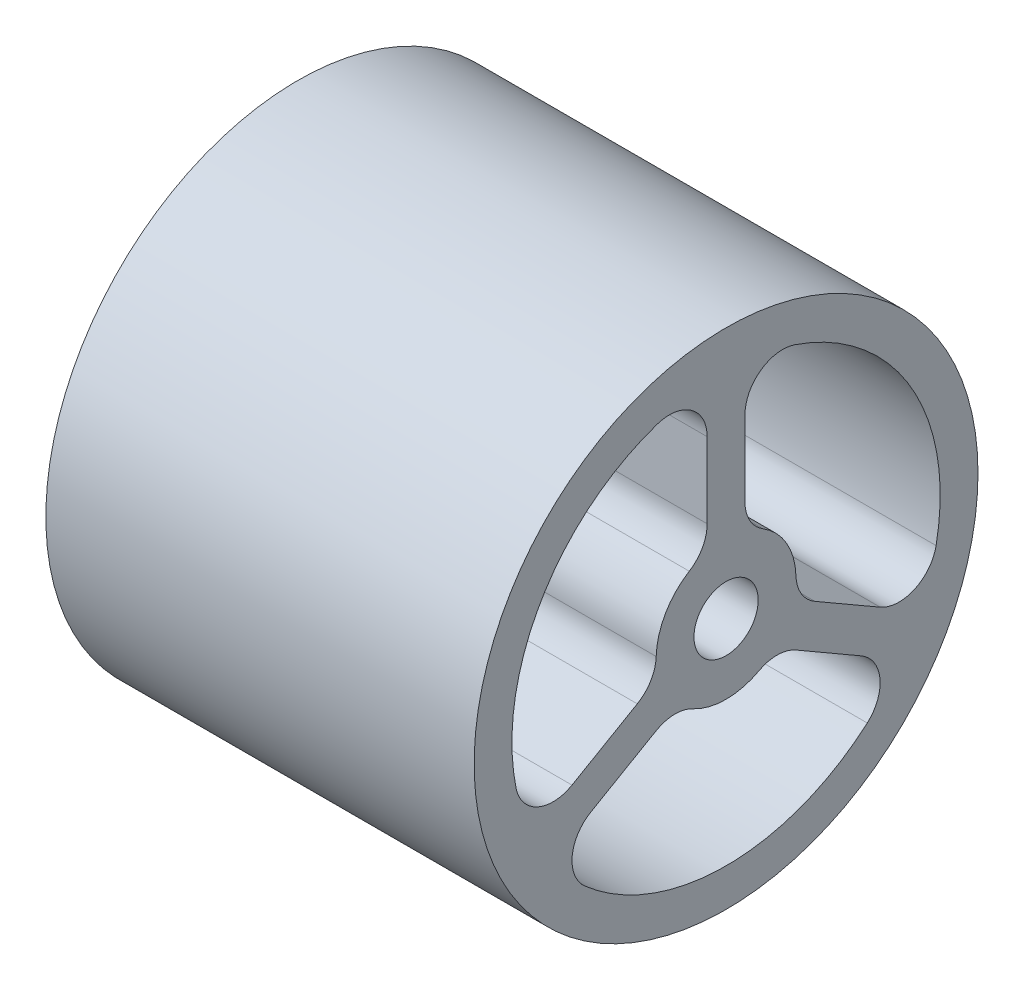
ISO-10303-21;
HEADER;
FILE_DESCRIPTION(('STEP AP214'),'2;1');
FILE_NAME('part.step','',(''),(''),'','','');
FILE_SCHEMA(('AUTOMOTIVE_DESIGN { 1 0 10303 214 1 1 1 1 }'));
ENDSEC;
DATA;
#1=APPLICATION_CONTEXT('core data for automotive mechanical design processes');
#2=APPLICATION_PROTOCOL_DEFINITION('international standard','automotive_design',2000,#1);
#3=PRODUCT_CONTEXT('',#1,'mechanical');
#4=PRODUCT('Part','Part','',(#3));
#5=PRODUCT_RELATED_PRODUCT_CATEGORY('part','',(#4));
#6=PRODUCT_DEFINITION_FORMATION('','',#4);
#7=PRODUCT_DEFINITION_CONTEXT('part definition',#1,'design');
#8=PRODUCT_DEFINITION('design','',#6,#7);
#9=PRODUCT_DEFINITION_SHAPE('','',#8);
#10=(LENGTH_UNIT() NAMED_UNIT(*) SI_UNIT(.MILLI.,.METRE.));
#11=(NAMED_UNIT(*) PLANE_ANGLE_UNIT() SI_UNIT($,.RADIAN.));
#12=(NAMED_UNIT(*) SI_UNIT($,.STERADIAN.) SOLID_ANGLE_UNIT());
#13=UNCERTAINTY_MEASURE_WITH_UNIT(LENGTH_MEASURE(1.E-05),#10,'distance_accuracy_value','');
#14=(GEOMETRIC_REPRESENTATION_CONTEXT(3) GLOBAL_UNCERTAINTY_ASSIGNED_CONTEXT((#13)) GLOBAL_UNIT_ASSIGNED_CONTEXT((#10,
#11,#12)) REPRESENTATION_CONTEXT('',''));
#15=CARTESIAN_POINT('',(0.,0.,0.));
#16=DIRECTION('',(0.,0.,1.));
#17=DIRECTION('',(1.,0.,0.));
#18=AXIS2_PLACEMENT_3D('',#15,#16,#17);
#19=CARTESIAN_POINT('',(34.,0.,0.));
#20=DIRECTION('',(-1.,0.,0.));
#21=DIRECTION('',(0.,0.,1.));
#22=AXIS2_PLACEMENT_3D('',#19,#20,#21);
#23=CYLINDRICAL_SURFACE('',#22,17.);
#24=CARTESIAN_POINT('',(34.,0.,0.));
#25=DIRECTION('',(1.,0.,0.));
#26=DIRECTION('',(0.,0.,-1.));
#27=AXIS2_PLACEMENT_3D('',#24,#25,#26);
#28=CIRCLE('',#27,17.);
#29=CARTESIAN_POINT('',(34.,-3.31672729076962,-16.6733116110347));
#30=VERTEX_POINT('',#29);
#31=CARTESIAN_POINT('',(34.,16.0978750657549,-5.46428571428572));
#32=VERTEX_POINT('',#31);
#33=EDGE_CURVE('E362',#30,#32,#28,.T.);
#34=ORIENTED_EDGE('',*,*,#33,.T.);
#35=DIRECTION('',(-1.,0.,0.));
#36=VECTOR('',#35,1.);
#37=CARTESIAN_POINT('',(34.,16.0978750657549,-5.46428571428572));
#38=LINE('',#37,#36);
#39=CARTESIAN_POINT('',(0.,16.0978750657549,-5.46428571428572));
#40=VERTEX_POINT('',#39);
#41=EDGE_CURVE('E215',#32,#40,#38,.T.);
#42=ORIENTED_EDGE('',*,*,#41,.T.);
#43=CARTESIAN_POINT('',(0.,0.,0.));
#44=DIRECTION('',(1.,0.,0.));
#45=DIRECTION('',(0.,0.,-1.));
#46=AXIS2_PLACEMENT_3D('',#43,#44,#45);
#47=CIRCLE('',#46,17.);
#48=CARTESIAN_POINT('',(0.,-3.31672729076962,-16.6733116110347));
#49=VERTEX_POINT('',#48);
#50=EDGE_CURVE('E199',#49,#40,#47,.T.);
#51=ORIENTED_EDGE('',*,*,#50,.F.);
#52=DIRECTION('',(-1.,0.,0.));
#53=VECTOR('',#52,1.);
#54=CARTESIAN_POINT('',(34.,-3.31672729076962,-16.6733116110347));
#55=LINE('',#54,#53);
#56=EDGE_CURVE('E212',#49,#30,#55,.F.);
#57=ORIENTED_EDGE('',*,*,#56,.T.);
#58=EDGE_LOOP('',(#34,#42,#51,#57));
#59=FACE_BOUND('',#58,.T.);
#60=ADVANCED_FACE('F33',(#59),#23,.F.);
#61=CARTESIAN_POINT('',(34.,1.29903810567666,-0.750000000000001));
#62=DIRECTION('',(0.,0.866025403784439,-0.5));
#63=DIRECTION('',(0.,0.5,0.866025403784439));
#64=AXIS2_PLACEMENT_3D('',#61,#62,#63);
#65=PLANE('',#64);
#66=DIRECTION('',(0.,-0.5,-0.866025403784439));
#67=VECTOR('',#66,1.);
#68=CARTESIAN_POINT('',(0.,1.29903810567666,-0.750000000000001));
#69=LINE('',#68,#67);
#70=CARTESIAN_POINT('',(0.,-2.33594813913913,-7.04598086083495));
#71=VERTEX_POINT('',#70);
#72=CARTESIAN_POINT('',(0.,-5.32949868610477,-12.230962503205));
#73=VERTEX_POINT('',#72);
#74=EDGE_CURVE('E201',#71,#73,#69,.T.);
#75=ORIENTED_EDGE('',*,*,#74,.F.);
#76=DIRECTION('',(-1.,0.,0.));
#77=VECTOR('',#76,1.);
#78=CARTESIAN_POINT('',(34.,-2.33594813913913,-7.04598086083495));
#79=LINE('',#78,#77);
#80=CARTESIAN_POINT('',(34.,-2.33594813913913,-7.04598086083495));
#81=VERTEX_POINT('',#80);
#82=EDGE_CURVE('E244',#71,#81,#79,.F.);
#83=ORIENTED_EDGE('',*,*,#82,.T.);
#84=DIRECTION('',(0.,-0.5,-0.866025403784439));
#85=VECTOR('',#84,1.);
#86=CARTESIAN_POINT('',(34.,1.29903810567666,-0.750000000000001));
#87=LINE('',#86,#85);
#88=CARTESIAN_POINT('',(34.,-5.32949868610477,-12.230962503205));
#89=VERTEX_POINT('',#88);
#90=EDGE_CURVE('E366',#81,#89,#87,.T.);
#91=ORIENTED_EDGE('',*,*,#90,.T.);
#92=DIRECTION('',(1.,0.,0.));
#93=VECTOR('',#92,1.);
#94=CARTESIAN_POINT('',(0.,-5.32949868610477,-12.230962503205));
#95=LINE('',#94,#93);
#96=EDGE_CURVE('E242',#89,#73,#95,.F.);
#97=ORIENTED_EDGE('',*,*,#96,.T.);
#98=EDGE_LOOP('',(#75,#83,#91,#97));
#99=FACE_BOUND('',#98,.T.);
#100=ADVANCED_FACE('F466',(#99),#65,.T.);
#101=CARTESIAN_POINT('',(34.,0.,0.));
#102=DIRECTION('',(-1.,0.,0.));
#103=DIRECTION('',(0.,0.,1.));
#104=AXIS2_PLACEMENT_3D('',#101,#102,#103);
#105=CYLINDRICAL_SURFACE('',#104,5.55);
#106=CARTESIAN_POINT('',(0.,0.,0.));
#107=DIRECTION('',(1.,0.,0.));
#108=DIRECTION('',(0.,0.,-1.));
#109=AXIS2_PLACEMENT_3D('',#106,#107,#108);
#110=CIRCLE('',#109,5.55);
#111=CARTESIAN_POINT('',(0.,0.17015331003377,-5.54739108510339));
#112=VERTEX_POINT('',#111);
#113=CARTESIAN_POINT('',(0.,4.71910494940997,-2.92105263157895));
#114=VERTEX_POINT('',#113);
#115=EDGE_CURVE('E387',#112,#114,#110,.T.);
#116=ORIENTED_EDGE('',*,*,#115,.T.);
#117=DIRECTION('',(-1.,0.,0.));
#118=VECTOR('',#117,1.);
#119=CARTESIAN_POINT('',(34.,4.71910494940997,-2.92105263157895));
#120=LINE('',#119,#118);
#121=CARTESIAN_POINT('',(34.,4.71910494940997,-2.92105263157895));
#122=VERTEX_POINT('',#121);
#123=EDGE_CURVE('E240',#114,#122,#120,.F.);
#124=ORIENTED_EDGE('',*,*,#123,.T.);
#125=CARTESIAN_POINT('',(34.,0.,0.));
#126=DIRECTION('',(1.,0.,0.));
#127=DIRECTION('',(0.,0.,-1.));
#128=AXIS2_PLACEMENT_3D('',#125,#126,#127);
#129=CIRCLE('',#128,5.55);
#130=CARTESIAN_POINT('',(34.,0.17015331003377,-5.54739108510339));
#131=VERTEX_POINT('',#130);
#132=EDGE_CURVE('E355',#131,#122,#129,.T.);
#133=ORIENTED_EDGE('',*,*,#132,.F.);
#134=DIRECTION('',(-1.,0.,0.));
#135=VECTOR('',#134,1.);
#136=CARTESIAN_POINT('',(34.,0.17015331003377,-5.54739108510339));
#137=LINE('',#136,#135);
#138=EDGE_CURVE('E237',#131,#112,#137,.T.);
#139=ORIENTED_EDGE('',*,*,#138,.T.);
#140=EDGE_LOOP('',(#116,#124,#133,#139));
#141=FACE_BOUND('',#140,.T.);
#142=ADVANCED_FACE('F448',(#141),#105,.T.);
#143=CARTESIAN_POINT('',(34.,-1.29903810567666,0.75));
#144=DIRECTION('',(0.,0.866025403784439,-0.5));
#145=DIRECTION('',(0.,0.5,0.866025403784439));
#146=AXIS2_PLACEMENT_3D('',#143,#144,#145);
#147=PLANE('',#146);
#148=DIRECTION('',(0.,-0.5,-0.866025403784439));
#149=VECTOR('',#148,1.);
#150=CARTESIAN_POINT('',(34.,-1.29903810567666,0.75));
#151=LINE('',#150,#149);
#152=CARTESIAN_POINT('',(34.,-4.93402435049245,-5.54598086083495));
#153=VERTEX_POINT('',#152);
#154=CARTESIAN_POINT('',(34.,-7.92757489745809,-10.730962503205));
#155=VERTEX_POINT('',#154);
#156=EDGE_CURVE('E352',#153,#155,#151,.T.);
#157=ORIENTED_EDGE('',*,*,#156,.F.);
#158=DIRECTION('',(1.,0.,0.));
#159=VECTOR('',#158,1.);
#160=CARTESIAN_POINT('',(0.,-4.93402435049245,-5.54598086083495));
#161=LINE('',#160,#159);
#162=CARTESIAN_POINT('',(0.,-4.93402435049245,-5.54598086083495));
#163=VERTEX_POINT('',#162);
#164=EDGE_CURVE('E248',#153,#163,#161,.F.);
#165=ORIENTED_EDGE('',*,*,#164,.T.);
#166=DIRECTION('',(0.,-0.5,-0.866025403784439));
#167=VECTOR('',#166,1.);
#168=CARTESIAN_POINT('',(0.,-1.29903810567666,0.75));
#169=LINE('',#168,#167);
#170=CARTESIAN_POINT('',(0.,-7.92757489745809,-10.730962503205));
#171=VERTEX_POINT('',#170);
#172=EDGE_CURVE('E386',#163,#171,#169,.T.);
#173=ORIENTED_EDGE('',*,*,#172,.T.);
#174=DIRECTION('',(-1.,0.,0.));
#175=VECTOR('',#174,1.);
#176=CARTESIAN_POINT('',(34.,-7.92757489745809,-10.730962503205));
#177=LINE('',#176,#175);
#178=EDGE_CURVE('E246',#171,#155,#177,.F.);
#179=ORIENTED_EDGE('',*,*,#178,.T.);
#180=EDGE_LOOP('',(#157,#165,#173,#179));
#181=FACE_BOUND('',#180,.T.);
#182=ADVANCED_FACE('F432',(#181),#147,.F.);
#183=CARTESIAN_POINT('',(0.,-12.7811477749853,11.209025896749));
#184=VERTEX_POINT('',#183);
#185=CARTESIAN_POINT('',(0.,-12.7811477749853,-11.209025896749));
#186=VERTEX_POINT('',#185);
#187=EDGE_CURVE('E219',#184,#186,#47,.T.);
#188=ORIENTED_EDGE('',*,*,#187,.F.);
#189=DIRECTION('',(-1.,0.,0.));
#190=VECTOR('',#189,1.);
#191=CARTESIAN_POINT('',(34.,-12.7811477749853,11.209025896749));
#192=LINE('',#191,#190);
#193=CARTESIAN_POINT('',(34.,-12.7811477749853,11.209025896749));
#194=VERTEX_POINT('',#193);
#195=EDGE_CURVE('E264',#184,#194,#192,.F.);
#196=ORIENTED_EDGE('',*,*,#195,.T.);
#197=CARTESIAN_POINT('',(34.,-12.7811477749853,-11.209025896749));
#198=VERTEX_POINT('',#197);
#199=EDGE_CURVE('E357',#194,#198,#28,.T.);
#200=ORIENTED_EDGE('',*,*,#199,.T.);
#201=DIRECTION('',(-1.,0.,0.));
#202=VECTOR('',#201,1.);
#203=CARTESIAN_POINT('',(34.,-12.7811477749853,-11.209025896749));
#204=LINE('',#203,#202);
#205=EDGE_CURVE('E261',#198,#186,#204,.T.);
#206=ORIENTED_EDGE('',*,*,#205,.T.);
#207=EDGE_LOOP('',(#188,#196,#200,#206));
#208=FACE_BOUND('',#207,.T.);
#209=ADVANCED_FACE('F425',(#208),#23,.F.);
#210=CARTESIAN_POINT('',(34.,-1.29903810567666,-0.749999999999999));
#211=DIRECTION('',(0.,-0.866025403784439,-0.5));
#212=DIRECTION('',(0.,0.5,-0.866025403784439));
#213=AXIS2_PLACEMENT_3D('',#210,#211,#212);
#214=PLANE('',#213);
#215=DIRECTION('',(0.,-0.5,0.866025403784439));
#216=VECTOR('',#215,1.);
#217=CARTESIAN_POINT('',(0.,-1.29903810567666,-0.749999999999999));
#218=LINE('',#217,#216);
#219=CARTESIAN_POINT('',(0.,-4.93402435049245,5.54598086083495));
#220=VERTEX_POINT('',#219);
#221=CARTESIAN_POINT('',(0.,-7.92757489745808,10.730962503205));
#222=VERTEX_POINT('',#221);
#223=EDGE_CURVE('E390',#220,#222,#218,.T.);
#224=ORIENTED_EDGE('',*,*,#223,.F.);
#225=DIRECTION('',(-1.,0.,0.));
#226=VECTOR('',#225,1.);
#227=CARTESIAN_POINT('',(34.,-4.93402435049245,5.54598086083495));
#228=LINE('',#227,#226);
#229=CARTESIAN_POINT('',(34.,-4.93402435049245,5.54598086083495));
#230=VERTEX_POINT('',#229);
#231=EDGE_CURVE('E259',#220,#230,#228,.F.);
#232=ORIENTED_EDGE('',*,*,#231,.T.);
#233=DIRECTION('',(0.,-0.5,0.866025403784439));
#234=VECTOR('',#233,1.);
#235=CARTESIAN_POINT('',(34.,-1.29903810567666,-0.749999999999999));
#236=LINE('',#235,#234);
#237=CARTESIAN_POINT('',(34.,-7.92757489745808,10.730962503205));
#238=VERTEX_POINT('',#237);
#239=EDGE_CURVE('E363',#230,#238,#236,.T.);
#240=ORIENTED_EDGE('',*,*,#239,.T.);
#241=DIRECTION('',(1.,0.,0.));
#242=VECTOR('',#241,1.);
#243=CARTESIAN_POINT('',(0.,-7.92757489745808,10.730962503205));
#244=LINE('',#243,#242);
#245=EDGE_CURVE('E256',#238,#222,#244,.F.);
#246=ORIENTED_EDGE('',*,*,#245,.T.);
#247=EDGE_LOOP('',(#224,#232,#240,#246));
#248=FACE_BOUND('',#247,.T.);
#249=ADVANCED_FACE('F415',(#248),#214,.T.);
#250=CARTESIAN_POINT('',(0.,-4.88925825944374,2.62633845352444));
#251=VERTEX_POINT('',#250);
#252=CARTESIAN_POINT('',(0.,-4.88925825944374,-2.62633845352444));
#253=VERTEX_POINT('',#252);
#254=EDGE_CURVE('E216',#251,#253,#110,.T.);
#255=ORIENTED_EDGE('',*,*,#254,.T.);
#256=DIRECTION('',(-1.,0.,0.));
#257=VECTOR('',#256,1.);
#258=CARTESIAN_POINT('',(34.,-4.88925825944374,-2.62633845352444));
#259=LINE('',#258,#257);
#260=CARTESIAN_POINT('',(34.,-4.88925825944374,-2.62633845352444));
#261=VERTEX_POINT('',#260);
#262=EDGE_CURVE('E254',#253,#261,#259,.F.);
#263=ORIENTED_EDGE('',*,*,#262,.T.);
#264=CARTESIAN_POINT('',(34.,-4.88925825944374,2.62633845352444));
#265=VERTEX_POINT('',#264);
#266=EDGE_CURVE('E354',#265,#261,#129,.T.);
#267=ORIENTED_EDGE('',*,*,#266,.F.);
#268=DIRECTION('',(-1.,0.,0.));
#269=VECTOR('',#268,1.);
#270=CARTESIAN_POINT('',(34.,-4.88925825944374,2.62633845352444));
#271=LINE('',#270,#269);
#272=EDGE_CURVE('E251',#265,#251,#271,.T.);
#273=ORIENTED_EDGE('',*,*,#272,.T.);
#274=EDGE_LOOP('',(#255,#263,#267,#273));
#275=FACE_BOUND('',#274,.T.);
#276=ADVANCED_FACE('F441',(#275),#105,.T.);
#277=CARTESIAN_POINT('',(34.,1.29903810567666,0.749999999999999));
#278=DIRECTION('',(0.,-0.866025403784439,-0.5));
#279=DIRECTION('',(0.,0.5,-0.866025403784439));
#280=AXIS2_PLACEMENT_3D('',#277,#278,#279);
#281=PLANE('',#280);
#282=DIRECTION('',(0.,-0.5,0.866025403784439));
#283=VECTOR('',#282,1.);
#284=CARTESIAN_POINT('',(34.,1.29903810567666,0.749999999999999));
#285=LINE('',#284,#283);
#286=CARTESIAN_POINT('',(34.,-2.33594813913913,7.04598086083495));
#287=VERTEX_POINT('',#286);
#288=CARTESIAN_POINT('',(34.,-5.32949868610477,12.230962503205));
#289=VERTEX_POINT('',#288);
#290=EDGE_CURVE('E400',#287,#289,#285,.T.);
#291=ORIENTED_EDGE('',*,*,#290,.F.);
#292=DIRECTION('',(1.,0.,0.));
#293=VECTOR('',#292,1.);
#294=CARTESIAN_POINT('',(0.,-2.33594813913913,7.04598086083495));
#295=LINE('',#294,#293);
#296=CARTESIAN_POINT('',(0.,-2.33594813913913,7.04598086083495));
#297=VERTEX_POINT('',#296);
#298=EDGE_CURVE('E268',#287,#297,#295,.F.);
#299=ORIENTED_EDGE('',*,*,#298,.T.);
#300=DIRECTION('',(0.,-0.5,0.866025403784439));
#301=VECTOR('',#300,1.);
#302=CARTESIAN_POINT('',(0.,1.29903810567666,0.749999999999999));
#303=LINE('',#302,#301);
#304=CARTESIAN_POINT('',(0.,-5.32949868610477,12.230962503205));
#305=VERTEX_POINT('',#304);
#306=EDGE_CURVE('E381',#297,#305,#303,.T.);
#307=ORIENTED_EDGE('',*,*,#306,.T.);
#308=DIRECTION('',(-1.,0.,0.));
#309=VECTOR('',#308,1.);
#310=CARTESIAN_POINT('',(34.,-5.32949868610477,12.230962503205));
#311=LINE('',#310,#309);
#312=EDGE_CURVE('E266',#305,#289,#311,.F.);
#313=ORIENTED_EDGE('',*,*,#312,.T.);
#314=EDGE_LOOP('',(#291,#299,#307,#313));
#315=FACE_BOUND('',#314,.T.);
#316=ADVANCED_FACE('F484',(#315),#281,.F.);
#317=CARTESIAN_POINT('',(0.,16.0978750657549,5.46428571428572));
#318=VERTEX_POINT('',#317);
#319=CARTESIAN_POINT('',(0.,-3.31672729076962,16.6733116110347));
#320=VERTEX_POINT('',#319);
#321=EDGE_CURVE('E218',#318,#320,#47,.T.);
#322=ORIENTED_EDGE('',*,*,#321,.F.);
#323=DIRECTION('',(-1.,0.,0.));
#324=VECTOR('',#323,1.);
#325=CARTESIAN_POINT('',(34.,16.0978750657549,5.46428571428572));
#326=LINE('',#325,#324);
#327=CARTESIAN_POINT('',(34.,16.0978750657549,5.46428571428572));
#328=VERTEX_POINT('',#327);
#329=EDGE_CURVE('E55',#318,#328,#326,.F.);
#330=ORIENTED_EDGE('',*,*,#329,.T.);
#331=CARTESIAN_POINT('',(34.,-3.31672729076962,16.6733116110347));
#332=VERTEX_POINT('',#331);
#333=EDGE_CURVE('E359',#328,#332,#28,.T.);
#334=ORIENTED_EDGE('',*,*,#333,.T.);
#335=DIRECTION('',(-1.,0.,0.));
#336=VECTOR('',#335,1.);
#337=CARTESIAN_POINT('',(34.,-3.31672729076962,16.6733116110347));
#338=LINE('',#337,#336);
#339=EDGE_CURVE('E281',#332,#320,#338,.T.);
#340=ORIENTED_EDGE('',*,*,#339,.T.);
#341=EDGE_LOOP('',(#322,#330,#334,#340));
#342=FACE_BOUND('',#341,.T.);
#343=ADVANCED_FACE('F475',(#342),#23,.F.);
#344=CARTESIAN_POINT('',(34.,0.,1.5));
#345=DIRECTION('',(0.,0.,1.));
#346=DIRECTION('',(1.,0.,0.));
#347=AXIS2_PLACEMENT_3D('',#344,#345,#346);
#348=PLANE('',#347);
#349=DIRECTION('',(0.,1.,0.));
#350=VECTOR('',#349,1.);
#351=CARTESIAN_POINT('',(34.,0.,1.5));
#352=LINE('',#351,#350);
#353=CARTESIAN_POINT('',(34.,7.26997248963158,1.5));
#354=VERTEX_POINT('',#353);
#355=CARTESIAN_POINT('',(34.,13.2570735835629,1.5));
#356=VERTEX_POINT('',#355);
#357=EDGE_CURVE('E348',#354,#356,#352,.T.);
#358=ORIENTED_EDGE('',*,*,#357,.T.);
#359=DIRECTION('',(1.,0.,0.));
#360=VECTOR('',#359,1.);
#361=CARTESIAN_POINT('',(0.,13.2570735835629,1.5));
#362=LINE('',#361,#360);
#363=CARTESIAN_POINT('',(0.,13.2570735835629,1.5));
#364=VERTEX_POINT('',#363);
#365=EDGE_CURVE('E278',#356,#364,#362,.F.);
#366=ORIENTED_EDGE('',*,*,#365,.T.);
#367=DIRECTION('',(0.,1.,0.));
#368=VECTOR('',#367,1.);
#369=CARTESIAN_POINT('',(0.,0.,1.5));
#370=LINE('',#369,#368);
#371=CARTESIAN_POINT('',(0.,7.26997248963158,1.5));
#372=VERTEX_POINT('',#371);
#373=EDGE_CURVE('E329',#372,#364,#370,.T.);
#374=ORIENTED_EDGE('',*,*,#373,.F.);
#375=DIRECTION('',(-1.,0.,0.));
#376=VECTOR('',#375,1.);
#377=CARTESIAN_POINT('',(34.,7.26997248963158,1.5));
#378=LINE('',#377,#376);
#379=EDGE_CURVE('E276',#372,#354,#378,.F.);
#380=ORIENTED_EDGE('',*,*,#379,.T.);
#381=EDGE_LOOP('',(#358,#366,#374,#380));
#382=FACE_BOUND('',#381,.T.);
#383=ADVANCED_FACE('F337',(#382),#348,.T.);
#384=CARTESIAN_POINT('',(0.,4.71910494940997,2.92105263157895));
#385=VERTEX_POINT('',#384);
#386=CARTESIAN_POINT('',(0.,0.170153310033769,5.54739108510339));
#387=VERTEX_POINT('',#386);
#388=EDGE_CURVE('E331',#385,#387,#110,.T.);
#389=ORIENTED_EDGE('',*,*,#388,.T.);
#390=DIRECTION('',(-1.,0.,0.));
#391=VECTOR('',#390,1.);
#392=CARTESIAN_POINT('',(34.,0.170153310033769,5.54739108510339));
#393=LINE('',#392,#391);
#394=CARTESIAN_POINT('',(34.,0.170153310033769,5.54739108510339));
#395=VERTEX_POINT('',#394);
#396=EDGE_CURVE('E274',#387,#395,#393,.F.);
#397=ORIENTED_EDGE('',*,*,#396,.T.);
#398=CARTESIAN_POINT('',(34.,4.71910494940997,2.92105263157895));
#399=VERTEX_POINT('',#398);
#400=EDGE_CURVE('E346',#399,#395,#129,.T.);
#401=ORIENTED_EDGE('',*,*,#400,.F.);
#402=DIRECTION('',(-1.,0.,0.));
#403=VECTOR('',#402,1.);
#404=CARTESIAN_POINT('',(34.,4.71910494940997,2.92105263157895));
#405=LINE('',#404,#403);
#406=EDGE_CURVE('E271',#399,#385,#405,.T.);
#407=ORIENTED_EDGE('',*,*,#406,.T.);
#408=EDGE_LOOP('',(#389,#397,#401,#407));
#409=FACE_BOUND('',#408,.T.);
#410=ADVANCED_FACE('F350',(#409),#105,.T.);
#411=CARTESIAN_POINT('',(34.,0.,0.));
#412=DIRECTION('',(-1.,0.,0.));
#413=DIRECTION('',(0.,0.,1.));
#414=AXIS2_PLACEMENT_3D('',#411,#412,#413);
#415=CYLINDRICAL_SURFACE('',#414,2.55);
#416=CARTESIAN_POINT('',(34.,0.,0.));
#417=DIRECTION('',(1.,0.,0.));
#418=DIRECTION('',(0.,0.,-1.));
#419=AXIS2_PLACEMENT_3D('',#416,#417,#418);
#420=CIRCLE('',#419,2.55);
#421=CARTESIAN_POINT('',(34.,0.,-2.55));
#422=VERTEX_POINT('',#421);
#423=EDGE_CURVE('E227',#422,#422,#420,.T.);
#424=ORIENTED_EDGE('',*,*,#423,.T.);
#425=EDGE_LOOP('',(#424));
#426=FACE_BOUND('',#425,.T.);
#427=CARTESIAN_POINT('',(0.,0.,0.));
#428=DIRECTION('',(1.,0.,0.));
#429=DIRECTION('',(0.,0.,-1.));
#430=AXIS2_PLACEMENT_3D('',#427,#428,#429);
#431=CIRCLE('',#430,2.55);
#432=CARTESIAN_POINT('',(0.,0.,-2.55));
#433=VERTEX_POINT('',#432);
#434=EDGE_CURVE('E396',#433,#433,#431,.T.);
#435=ORIENTED_EDGE('',*,*,#434,.F.);
#436=EDGE_LOOP('',(#435));
#437=FACE_BOUND('',#436,.T.);
#438=ADVANCED_FACE('F562',(#426,#437),#415,.F.);
#439=CARTESIAN_POINT('',(34.,0.,-1.5));
#440=DIRECTION('',(0.,0.,1.));
#441=DIRECTION('',(1.,0.,0.));
#442=AXIS2_PLACEMENT_3D('',#439,#440,#441);
#443=PLANE('',#442);
#444=DIRECTION('',(0.,1.,0.));
#445=VECTOR('',#444,1.);
#446=CARTESIAN_POINT('',(0.,0.,-1.5));
#447=LINE('',#446,#445);
#448=CARTESIAN_POINT('',(0.,7.26997248963158,-1.5));
#449=VERTEX_POINT('',#448);
#450=CARTESIAN_POINT('',(0.,13.2570735835629,-1.5));
#451=VERTEX_POINT('',#450);
#452=EDGE_CURVE('E394',#449,#451,#447,.T.);
#453=ORIENTED_EDGE('',*,*,#452,.T.);
#454=DIRECTION('',(-1.,0.,0.));
#455=VECTOR('',#454,1.);
#456=CARTESIAN_POINT('',(34.,13.2570735835629,-1.5));
#457=LINE('',#456,#455);
#458=CARTESIAN_POINT('',(34.,13.2570735835629,-1.5));
#459=VERTEX_POINT('',#458);
#460=EDGE_CURVE('E235',#451,#459,#457,.F.);
#461=ORIENTED_EDGE('',*,*,#460,.T.);
#462=DIRECTION('',(0.,1.,0.));
#463=VECTOR('',#462,1.);
#464=CARTESIAN_POINT('',(34.,0.,-1.5));
#465=LINE('',#464,#463);
#466=CARTESIAN_POINT('',(34.,7.26997248963158,-1.5));
#467=VERTEX_POINT('',#466);
#468=EDGE_CURVE('E365',#467,#459,#465,.T.);
#469=ORIENTED_EDGE('',*,*,#468,.F.);
#470=DIRECTION('',(1.,0.,0.));
#471=VECTOR('',#470,1.);
#472=CARTESIAN_POINT('',(0.,7.26997248963158,-1.5));
#473=LINE('',#472,#471);
#474=EDGE_CURVE('E224',#467,#449,#473,.F.);
#475=ORIENTED_EDGE('',*,*,#474,.T.);
#476=EDGE_LOOP('',(#453,#461,#469,#475));
#477=FACE_BOUND('',#476,.T.);
#478=ADVANCED_FACE('F457',(#477),#443,.F.);
#479=CARTESIAN_POINT('',(34.,0.,0.));
#480=DIRECTION('',(-1.,0.,0.));
#481=DIRECTION('',(0.,0.,1.));
#482=AXIS2_PLACEMENT_3D('',#479,#480,#481);
#483=CYLINDRICAL_SURFACE('',#482,20.);
#484=CARTESIAN_POINT('',(34.,0.,0.));
#485=DIRECTION('',(1.,0.,0.));
#486=DIRECTION('',(0.,0.,-1.));
#487=AXIS2_PLACEMENT_3D('',#484,#485,#486);
#488=CIRCLE('',#487,20.);
#489=CARTESIAN_POINT('',(34.,0.,-20.));
#490=VERTEX_POINT('',#489);
#491=EDGE_CURVE('E222',#490,#490,#488,.T.);
#492=ORIENTED_EDGE('',*,*,#491,.F.);
#493=EDGE_LOOP('',(#492));
#494=FACE_BOUND('',#493,.T.);
#495=CARTESIAN_POINT('',(0.,0.,0.));
#496=DIRECTION('',(1.,0.,0.));
#497=DIRECTION('',(0.,0.,-1.));
#498=AXIS2_PLACEMENT_3D('',#495,#496,#497);
#499=CIRCLE('',#498,20.);
#500=CARTESIAN_POINT('',(0.,0.,-20.));
#501=VERTEX_POINT('',#500);
#502=EDGE_CURVE('E230',#501,#501,#499,.T.);
#503=ORIENTED_EDGE('',*,*,#502,.T.);
#504=EDGE_LOOP('',(#503));
#505=FACE_BOUND('',#504,.T.);
#506=ADVANCED_FACE('F578',(#494,#505),#483,.T.);
#507=CARTESIAN_POINT('',(34.,0.,0.));
#508=DIRECTION('',(1.,0.,0.));
#509=DIRECTION('',(0.,0.,-1.));
#510=AXIS2_PLACEMENT_3D('',#507,#508,#509);
#511=PLANE('',#510);
#512=ORIENTED_EDGE('',*,*,#400,.T.);
#513=CARTESIAN_POINT('',(34.,0.262128072214184,8.54598086083495));
#514=DIRECTION('',(1.,0.,0.));
#515=DIRECTION('',(0.,0.,-1.));
#516=AXIS2_PLACEMENT_3D('',#513,#514,#515);
#517=CIRCLE('',#516,3.);
#518=EDGE_CURVE('E315',#395,#287,#517,.F.);
#519=ORIENTED_EDGE('',*,*,#518,.T.);
#520=ORIENTED_EDGE('',*,*,#290,.T.);
#521=CARTESIAN_POINT('',(34.,-2.73142247475145,13.730962503205));
#522=DIRECTION('',(1.,0.,0.));
#523=DIRECTION('',(0.,0.,-1.));
#524=AXIS2_PLACEMENT_3D('',#521,#522,#523);
#525=CIRCLE('',#524,3.);
#526=EDGE_CURVE('E48',#289,#332,#525,.F.);
#527=ORIENTED_EDGE('',*,*,#526,.T.);
#528=ORIENTED_EDGE('',*,*,#333,.F.);
#529=CARTESIAN_POINT('',(34.,13.2570735835629,4.5));
#530=DIRECTION('',(1.,0.,0.));
#531=DIRECTION('',(0.,0.,-1.));
#532=AXIS2_PLACEMENT_3D('',#529,#530,#531);
#533=CIRCLE('',#532,3.);
#534=EDGE_CURVE('E319',#328,#356,#533,.F.);
#535=ORIENTED_EDGE('',*,*,#534,.T.);
#536=ORIENTED_EDGE('',*,*,#357,.F.);
#537=CARTESIAN_POINT('',(34.,7.26997248963158,4.5));
#538=DIRECTION('',(1.,0.,0.));
#539=DIRECTION('',(0.,0.,-1.));
#540=AXIS2_PLACEMENT_3D('',#537,#538,#539);
#541=CIRCLE('',#540,3.);
#542=EDGE_CURVE('E11',#354,#399,#541,.F.);
#543=ORIENTED_EDGE('',*,*,#542,.T.);
#544=EDGE_LOOP('',(#512,#519,#520,#527,#528,#535,#536,#543));
#545=FACE_BOUND('',#544,.T.);
#546=ORIENTED_EDGE('',*,*,#266,.T.);
#547=CARTESIAN_POINT('',(34.,-7.53210056184576,-4.04598086083495));
#548=DIRECTION('',(1.,0.,0.));
#549=DIRECTION('',(0.,0.,-1.));
#550=AXIS2_PLACEMENT_3D('',#547,#548,#549);
#551=CIRCLE('',#550,3.);
#552=EDGE_CURVE('E299',#261,#153,#551,.F.);
#553=ORIENTED_EDGE('',*,*,#552,.T.);
#554=ORIENTED_EDGE('',*,*,#156,.T.);
#555=CARTESIAN_POINT('',(34.,-10.5256511088114,-9.23096250320503));
#556=DIRECTION('',(1.,0.,0.));
#557=DIRECTION('',(0.,0.,-1.));
#558=AXIS2_PLACEMENT_3D('',#555,#556,#557);
#559=CIRCLE('',#558,3.);
#560=EDGE_CURVE('E311',#155,#198,#559,.F.);
#561=ORIENTED_EDGE('',*,*,#560,.T.);
#562=ORIENTED_EDGE('',*,*,#199,.F.);
#563=CARTESIAN_POINT('',(34.,-10.5256511088114,9.23096250320504));
#564=DIRECTION('',(1.,0.,0.));
#565=DIRECTION('',(0.,0.,-1.));
#566=AXIS2_PLACEMENT_3D('',#563,#564,#565);
#567=CIRCLE('',#566,3.);
#568=EDGE_CURVE('E307',#194,#238,#567,.F.);
#569=ORIENTED_EDGE('',*,*,#568,.T.);
#570=ORIENTED_EDGE('',*,*,#239,.F.);
#571=CARTESIAN_POINT('',(34.,-7.53210056184576,4.04598086083495));
#572=DIRECTION('',(1.,0.,0.));
#573=DIRECTION('',(0.,0.,-1.));
#574=AXIS2_PLACEMENT_3D('',#571,#572,#573);
#575=CIRCLE('',#574,3.);
#576=EDGE_CURVE('E303',#230,#265,#575,.F.);
#577=ORIENTED_EDGE('',*,*,#576,.T.);
#578=EDGE_LOOP('',(#546,#553,#554,#561,#562,#569,#570,#577));
#579=FACE_BOUND('',#578,.T.);
#580=ORIENTED_EDGE('',*,*,#33,.F.);
#581=CARTESIAN_POINT('',(34.,-2.73142247475145,-13.730962503205));
#582=DIRECTION('',(1.,0.,0.));
#583=DIRECTION('',(0.,0.,-1.));
#584=AXIS2_PLACEMENT_3D('',#581,#582,#583);
#585=CIRCLE('',#584,3.);
#586=EDGE_CURVE('E206',#30,#89,#585,.F.);
#587=ORIENTED_EDGE('',*,*,#586,.T.);
#588=ORIENTED_EDGE('',*,*,#90,.F.);
#589=CARTESIAN_POINT('',(34.,0.262128072214186,-8.54598086083495));
#590=DIRECTION('',(1.,0.,0.));
#591=DIRECTION('',(0.,0.,-1.));
#592=AXIS2_PLACEMENT_3D('',#589,#590,#591);
#593=CIRCLE('',#592,3.);
#594=EDGE_CURVE('E207',#81,#131,#593,.F.);
#595=ORIENTED_EDGE('',*,*,#594,.T.);
#596=ORIENTED_EDGE('',*,*,#132,.T.);
#597=CARTESIAN_POINT('',(34.,7.26997248963158,-4.5));
#598=DIRECTION('',(1.,0.,0.));
#599=DIRECTION('',(0.,0.,-1.));
#600=AXIS2_PLACEMENT_3D('',#597,#598,#599);
#601=CIRCLE('',#600,3.);
#602=EDGE_CURVE('E291',#122,#467,#601,.F.);
#603=ORIENTED_EDGE('',*,*,#602,.T.);
#604=ORIENTED_EDGE('',*,*,#468,.T.);
#605=CARTESIAN_POINT('',(34.,13.2570735835629,-4.5));
#606=DIRECTION('',(1.,0.,0.));
#607=DIRECTION('',(0.,0.,-1.));
#608=AXIS2_PLACEMENT_3D('',#605,#606,#607);
#609=CIRCLE('',#608,3.);
#610=EDGE_CURVE('E287',#459,#32,#609,.F.);
#611=ORIENTED_EDGE('',*,*,#610,.T.);
#612=EDGE_LOOP('',(#580,#587,#588,#595,#596,#603,#604,#611));
#613=FACE_BOUND('',#612,.T.);
#614=ORIENTED_EDGE('',*,*,#423,.F.);
#615=EDGE_LOOP('',(#614));
#616=FACE_BOUND('',#615,.T.);
#617=ORIENTED_EDGE('',*,*,#491,.T.);
#618=EDGE_LOOP('',(#617));
#619=FACE_BOUND('',#618,.T.);
#620=ADVANCED_FACE('F344',(#545,#579,#613,#616,#619),#511,.T.);
#621=CARTESIAN_POINT('',(0.,0.,0.));
#622=DIRECTION('',(1.,0.,0.));
#623=DIRECTION('',(0.,0.,-1.));
#624=AXIS2_PLACEMENT_3D('',#621,#622,#623);
#625=PLANE('',#624);
#626=ORIENTED_EDGE('',*,*,#306,.F.);
#627=CARTESIAN_POINT('',(0.,0.262128072214184,8.54598086083495));
#628=DIRECTION('',(1.,0.,0.));
#629=DIRECTION('',(0.,0.,-1.));
#630=AXIS2_PLACEMENT_3D('',#627,#628,#629);
#631=CIRCLE('',#630,3.);
#632=EDGE_CURVE('E313',#297,#387,#631,.T.);
#633=ORIENTED_EDGE('',*,*,#632,.T.);
#634=ORIENTED_EDGE('',*,*,#388,.F.);
#635=CARTESIAN_POINT('',(0.,7.26997248963158,4.5));
#636=DIRECTION('',(1.,0.,0.));
#637=DIRECTION('',(0.,0.,-1.));
#638=AXIS2_PLACEMENT_3D('',#635,#636,#637);
#639=CIRCLE('',#638,3.);
#640=EDGE_CURVE('E41',#385,#372,#639,.T.);
#641=ORIENTED_EDGE('',*,*,#640,.T.);
#642=ORIENTED_EDGE('',*,*,#373,.T.);
#643=CARTESIAN_POINT('',(0.,13.2570735835629,4.5));
#644=DIRECTION('',(1.,0.,0.));
#645=DIRECTION('',(0.,0.,-1.));
#646=AXIS2_PLACEMENT_3D('',#643,#644,#645);
#647=CIRCLE('',#646,3.);
#648=EDGE_CURVE('E317',#364,#318,#647,.T.);
#649=ORIENTED_EDGE('',*,*,#648,.T.);
#650=ORIENTED_EDGE('',*,*,#321,.T.);
#651=CARTESIAN_POINT('',(0.,-2.73142247475145,13.730962503205));
#652=DIRECTION('',(1.,0.,0.));
#653=DIRECTION('',(0.,0.,-1.));
#654=AXIS2_PLACEMENT_3D('',#651,#652,#653);
#655=CIRCLE('',#654,3.);
#656=EDGE_CURVE('E321',#320,#305,#655,.T.);
#657=ORIENTED_EDGE('',*,*,#656,.T.);
#658=EDGE_LOOP('',(#626,#633,#634,#641,#642,#649,#650,#657));
#659=FACE_BOUND('',#658,.T.);
#660=ORIENTED_EDGE('',*,*,#172,.F.);
#661=CARTESIAN_POINT('',(0.,-7.53210056184576,-4.04598086083495));
#662=DIRECTION('',(1.,0.,0.));
#663=DIRECTION('',(0.,0.,-1.));
#664=AXIS2_PLACEMENT_3D('',#661,#662,#663);
#665=CIRCLE('',#664,3.);
#666=EDGE_CURVE('E297',#163,#253,#665,.T.);
#667=ORIENTED_EDGE('',*,*,#666,.T.);
#668=ORIENTED_EDGE('',*,*,#254,.F.);
#669=CARTESIAN_POINT('',(0.,-7.53210056184576,4.04598086083495));
#670=DIRECTION('',(1.,0.,0.));
#671=DIRECTION('',(0.,0.,-1.));
#672=AXIS2_PLACEMENT_3D('',#669,#670,#671);
#673=CIRCLE('',#672,3.);
#674=EDGE_CURVE('E301',#251,#220,#673,.T.);
#675=ORIENTED_EDGE('',*,*,#674,.T.);
#676=ORIENTED_EDGE('',*,*,#223,.T.);
#677=CARTESIAN_POINT('',(0.,-10.5256511088114,9.23096250320504));
#678=DIRECTION('',(1.,0.,0.));
#679=DIRECTION('',(0.,0.,-1.));
#680=AXIS2_PLACEMENT_3D('',#677,#678,#679);
#681=CIRCLE('',#680,3.);
#682=EDGE_CURVE('E305',#222,#184,#681,.T.);
#683=ORIENTED_EDGE('',*,*,#682,.T.);
#684=ORIENTED_EDGE('',*,*,#187,.T.);
#685=CARTESIAN_POINT('',(0.,-10.5256511088114,-9.23096250320503));
#686=DIRECTION('',(1.,0.,0.));
#687=DIRECTION('',(0.,0.,-1.));
#688=AXIS2_PLACEMENT_3D('',#685,#686,#687);
#689=CIRCLE('',#688,3.);
#690=EDGE_CURVE('E309',#186,#171,#689,.T.);
#691=ORIENTED_EDGE('',*,*,#690,.T.);
#692=EDGE_LOOP('',(#660,#667,#668,#675,#676,#683,#684,#691));
#693=FACE_BOUND('',#692,.T.);
#694=ORIENTED_EDGE('',*,*,#74,.T.);
#695=CARTESIAN_POINT('',(0.,-2.73142247475145,-13.730962503205));
#696=DIRECTION('',(1.,0.,0.));
#697=DIRECTION('',(0.,0.,-1.));
#698=AXIS2_PLACEMENT_3D('',#695,#696,#697);
#699=CIRCLE('',#698,3.);
#700=EDGE_CURVE('E195',#73,#49,#699,.T.);
#701=ORIENTED_EDGE('',*,*,#700,.T.);
#702=ORIENTED_EDGE('',*,*,#50,.T.);
#703=CARTESIAN_POINT('',(0.,13.2570735835629,-4.5));
#704=DIRECTION('',(1.,0.,0.));
#705=DIRECTION('',(0.,0.,-1.));
#706=AXIS2_PLACEMENT_3D('',#703,#704,#705);
#707=CIRCLE('',#706,3.);
#708=EDGE_CURVE('E285',#40,#451,#707,.T.);
#709=ORIENTED_EDGE('',*,*,#708,.T.);
#710=ORIENTED_EDGE('',*,*,#452,.F.);
#711=CARTESIAN_POINT('',(0.,7.26997248963158,-4.5));
#712=DIRECTION('',(1.,0.,0.));
#713=DIRECTION('',(0.,0.,-1.));
#714=AXIS2_PLACEMENT_3D('',#711,#712,#713);
#715=CIRCLE('',#714,3.);
#716=EDGE_CURVE('E289',#449,#114,#715,.T.);
#717=ORIENTED_EDGE('',*,*,#716,.T.);
#718=ORIENTED_EDGE('',*,*,#115,.F.);
#719=CARTESIAN_POINT('',(0.,0.262128072214186,-8.54598086083495));
#720=DIRECTION('',(1.,0.,0.));
#721=DIRECTION('',(0.,0.,-1.));
#722=AXIS2_PLACEMENT_3D('',#719,#720,#721);
#723=CIRCLE('',#722,3.);
#724=EDGE_CURVE('E293',#112,#71,#723,.T.);
#725=ORIENTED_EDGE('',*,*,#724,.T.);
#726=EDGE_LOOP('',(#694,#701,#702,#709,#710,#717,#718,#725));
#727=FACE_BOUND('',#726,.T.);
#728=ORIENTED_EDGE('',*,*,#434,.T.);
#729=EDGE_LOOP('',(#728));
#730=FACE_BOUND('',#729,.T.);
#731=ORIENTED_EDGE('',*,*,#502,.F.);
#732=EDGE_LOOP('',(#731));
#733=FACE_BOUND('',#732,.T.);
#734=ADVANCED_FACE('F197',(#659,#693,#727,#730,#733),#625,.F.);
#735=CARTESIAN_POINT('',(34.,13.2570735835629,-4.5));
#736=DIRECTION('',(-1.,0.,0.));
#737=DIRECTION('',(0.,0.,1.));
#738=AXIS2_PLACEMENT_3D('',#735,#736,#737);
#739=CYLINDRICAL_SURFACE('',#738,3.);
#740=ORIENTED_EDGE('',*,*,#610,.F.);
#741=ORIENTED_EDGE('',*,*,#460,.F.);
#742=ORIENTED_EDGE('',*,*,#708,.F.);
#743=ORIENTED_EDGE('',*,*,#41,.F.);
#744=EDGE_LOOP('',(#740,#741,#742,#743));
#745=FACE_BOUND('',#744,.T.);
#746=ADVANCED_FACE('F461',(#745),#739,.F.);
#747=CARTESIAN_POINT('',(34.,7.26997248963158,-4.5));
#748=DIRECTION('',(-1.,0.,0.));
#749=DIRECTION('',(0.,0.,1.));
#750=AXIS2_PLACEMENT_3D('',#747,#748,#749);
#751=CYLINDRICAL_SURFACE('',#750,3.);
#752=ORIENTED_EDGE('',*,*,#602,.F.);
#753=ORIENTED_EDGE('',*,*,#123,.F.);
#754=ORIENTED_EDGE('',*,*,#716,.F.);
#755=ORIENTED_EDGE('',*,*,#474,.F.);
#756=EDGE_LOOP('',(#752,#753,#754,#755));
#757=FACE_BOUND('',#756,.T.);
#758=ADVANCED_FACE('F451',(#757),#751,.F.);
#759=CARTESIAN_POINT('',(34.,0.262128072214186,-8.54598086083495));
#760=DIRECTION('',(-1.,0.,0.));
#761=DIRECTION('',(0.,0.,1.));
#762=AXIS2_PLACEMENT_3D('',#759,#760,#761);
#763=CYLINDRICAL_SURFACE('',#762,3.);
#764=ORIENTED_EDGE('',*,*,#594,.F.);
#765=ORIENTED_EDGE('',*,*,#82,.F.);
#766=ORIENTED_EDGE('',*,*,#724,.F.);
#767=ORIENTED_EDGE('',*,*,#138,.F.);
#768=EDGE_LOOP('',(#764,#765,#766,#767));
#769=FACE_BOUND('',#768,.T.);
#770=ADVANCED_FACE('F465',(#769),#763,.F.);
#771=CARTESIAN_POINT('',(34.,-2.73142247475145,-13.730962503205));
#772=DIRECTION('',(-1.,0.,0.));
#773=DIRECTION('',(0.,0.,1.));
#774=AXIS2_PLACEMENT_3D('',#771,#772,#773);
#775=CYLINDRICAL_SURFACE('',#774,3.);
#776=ORIENTED_EDGE('',*,*,#586,.F.);
#777=ORIENTED_EDGE('',*,*,#56,.F.);
#778=ORIENTED_EDGE('',*,*,#700,.F.);
#779=ORIENTED_EDGE('',*,*,#96,.F.);
#780=EDGE_LOOP('',(#776,#777,#778,#779));
#781=FACE_BOUND('',#780,.T.);
#782=ADVANCED_FACE('F221',(#781),#775,.F.);
#783=CARTESIAN_POINT('',(34.,-7.53210056184576,-4.04598086083495));
#784=DIRECTION('',(-1.,0.,0.));
#785=DIRECTION('',(0.,0.,1.));
#786=AXIS2_PLACEMENT_3D('',#783,#784,#785);
#787=CYLINDRICAL_SURFACE('',#786,3.);
#788=ORIENTED_EDGE('',*,*,#552,.F.);
#789=ORIENTED_EDGE('',*,*,#262,.F.);
#790=ORIENTED_EDGE('',*,*,#666,.F.);
#791=ORIENTED_EDGE('',*,*,#164,.F.);
#792=EDGE_LOOP('',(#788,#789,#790,#791));
#793=FACE_BOUND('',#792,.T.);
#794=ADVANCED_FACE('F436',(#793),#787,.F.);
#795=CARTESIAN_POINT('',(34.,-7.53210056184576,4.04598086083495));
#796=DIRECTION('',(-1.,0.,0.));
#797=DIRECTION('',(0.,0.,1.));
#798=AXIS2_PLACEMENT_3D('',#795,#796,#797);
#799=CYLINDRICAL_SURFACE('',#798,3.);
#800=ORIENTED_EDGE('',*,*,#576,.F.);
#801=ORIENTED_EDGE('',*,*,#231,.F.);
#802=ORIENTED_EDGE('',*,*,#674,.F.);
#803=ORIENTED_EDGE('',*,*,#272,.F.);
#804=EDGE_LOOP('',(#800,#801,#802,#803));
#805=FACE_BOUND('',#804,.T.);
#806=ADVANCED_FACE('F498',(#805),#799,.F.);
#807=CARTESIAN_POINT('',(34.,-10.5256511088114,9.23096250320504));
#808=DIRECTION('',(-1.,0.,0.));
#809=DIRECTION('',(0.,0.,1.));
#810=AXIS2_PLACEMENT_3D('',#807,#808,#809);
#811=CYLINDRICAL_SURFACE('',#810,3.);
#812=ORIENTED_EDGE('',*,*,#568,.F.);
#813=ORIENTED_EDGE('',*,*,#195,.F.);
#814=ORIENTED_EDGE('',*,*,#682,.F.);
#815=ORIENTED_EDGE('',*,*,#245,.F.);
#816=EDGE_LOOP('',(#812,#813,#814,#815));
#817=FACE_BOUND('',#816,.T.);
#818=ADVANCED_FACE('F420',(#817),#811,.F.);
#819=CARTESIAN_POINT('',(34.,-10.5256511088114,-9.23096250320503));
#820=DIRECTION('',(-1.,0.,0.));
#821=DIRECTION('',(0.,0.,1.));
#822=AXIS2_PLACEMENT_3D('',#819,#820,#821);
#823=CYLINDRICAL_SURFACE('',#822,3.);
#824=ORIENTED_EDGE('',*,*,#560,.F.);
#825=ORIENTED_EDGE('',*,*,#178,.F.);
#826=ORIENTED_EDGE('',*,*,#690,.F.);
#827=ORIENTED_EDGE('',*,*,#205,.F.);
#828=EDGE_LOOP('',(#824,#825,#826,#827));
#829=FACE_BOUND('',#828,.T.);
#830=ADVANCED_FACE('F428',(#829),#823,.F.);
#831=CARTESIAN_POINT('',(34.,0.262128072214184,8.54598086083495));
#832=DIRECTION('',(-1.,0.,0.));
#833=DIRECTION('',(0.,0.,1.));
#834=AXIS2_PLACEMENT_3D('',#831,#832,#833);
#835=CYLINDRICAL_SURFACE('',#834,3.);
#836=ORIENTED_EDGE('',*,*,#518,.F.);
#837=ORIENTED_EDGE('',*,*,#396,.F.);
#838=ORIENTED_EDGE('',*,*,#632,.F.);
#839=ORIENTED_EDGE('',*,*,#298,.F.);
#840=EDGE_LOOP('',(#836,#837,#838,#839));
#841=FACE_BOUND('',#840,.T.);
#842=ADVANCED_FACE('F506',(#841),#835,.F.);
#843=CARTESIAN_POINT('',(34.,13.2570735835629,4.5));
#844=DIRECTION('',(-1.,0.,0.));
#845=DIRECTION('',(0.,0.,1.));
#846=AXIS2_PLACEMENT_3D('',#843,#844,#845);
#847=CYLINDRICAL_SURFACE('',#846,3.);
#848=ORIENTED_EDGE('',*,*,#534,.F.);
#849=ORIENTED_EDGE('',*,*,#329,.F.);
#850=ORIENTED_EDGE('',*,*,#648,.F.);
#851=ORIENTED_EDGE('',*,*,#365,.F.);
#852=EDGE_LOOP('',(#848,#849,#850,#851));
#853=FACE_BOUND('',#852,.T.);
#854=ADVANCED_FACE('F509',(#853),#847,.F.);
#855=CARTESIAN_POINT('',(34.,-2.73142247475145,13.730962503205));
#856=DIRECTION('',(-1.,0.,0.));
#857=DIRECTION('',(0.,0.,1.));
#858=AXIS2_PLACEMENT_3D('',#855,#856,#857);
#859=CYLINDRICAL_SURFACE('',#858,3.);
#860=ORIENTED_EDGE('',*,*,#526,.F.);
#861=ORIENTED_EDGE('',*,*,#312,.F.);
#862=ORIENTED_EDGE('',*,*,#656,.F.);
#863=ORIENTED_EDGE('',*,*,#339,.F.);
#864=EDGE_LOOP('',(#860,#861,#862,#863));
#865=FACE_BOUND('',#864,.T.);
#866=ADVANCED_FACE('F512',(#865),#859,.F.);
#867=CARTESIAN_POINT('',(34.,7.26997248963158,4.5));
#868=DIRECTION('',(-1.,0.,0.));
#869=DIRECTION('',(0.,0.,1.));
#870=AXIS2_PLACEMENT_3D('',#867,#868,#869);
#871=CYLINDRICAL_SURFACE('',#870,3.);
#872=ORIENTED_EDGE('',*,*,#542,.F.);
#873=ORIENTED_EDGE('',*,*,#379,.F.);
#874=ORIENTED_EDGE('',*,*,#640,.F.);
#875=ORIENTED_EDGE('',*,*,#406,.F.);
#876=EDGE_LOOP('',(#872,#873,#874,#875));
#877=FACE_BOUND('',#876,.T.);
#878=ADVANCED_FACE('F35',(#877),#871,.F.);
#879=CLOSED_SHELL('',(#60,#100,#142,#182,#209,#249,#276,#316,#343,#383,#410,#438,#478,#506,#620,
#734,#746,#758,#770,#782,#794,#806,#818,#830,#842,#854,#866,#878));
#880=MANIFOLD_SOLID_BREP('B2',#879);
#881=ADVANCED_BREP_SHAPE_REPRESENTATION('',(#18,#880),#14);
#882=SHAPE_DEFINITION_REPRESENTATION(#9,#881);
ENDSEC;
END-ISO-10303-21;
